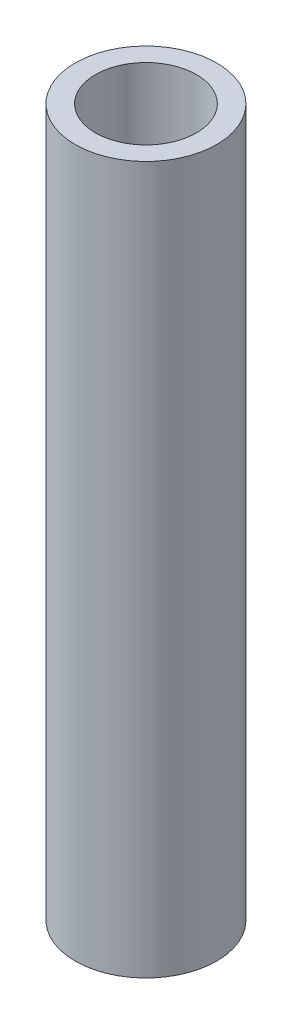
ISO-10303-21;
HEADER;
FILE_DESCRIPTION(('STEP AP214'),'2;1');
FILE_NAME('part.step','',(''),(''),'','','');
FILE_SCHEMA(('AUTOMOTIVE_DESIGN { 1 0 10303 214 1 1 1 1 }'));
ENDSEC;
DATA;
#1=APPLICATION_CONTEXT('core data for automotive mechanical design processes');
#2=APPLICATION_PROTOCOL_DEFINITION('international standard','automotive_design',2000,#1);
#3=PRODUCT_CONTEXT('',#1,'mechanical');
#4=PRODUCT('Part','Part','',(#3));
#5=PRODUCT_RELATED_PRODUCT_CATEGORY('part','',(#4));
#6=PRODUCT_DEFINITION_FORMATION('','',#4);
#7=PRODUCT_DEFINITION_CONTEXT('part definition',#1,'design');
#8=PRODUCT_DEFINITION('design','',#6,#7);
#9=PRODUCT_DEFINITION_SHAPE('','',#8);
#10=(LENGTH_UNIT() NAMED_UNIT(*) SI_UNIT(.MILLI.,.METRE.));
#11=(NAMED_UNIT(*) PLANE_ANGLE_UNIT() SI_UNIT($,.RADIAN.));
#12=(NAMED_UNIT(*) SI_UNIT($,.STERADIAN.) SOLID_ANGLE_UNIT());
#13=UNCERTAINTY_MEASURE_WITH_UNIT(LENGTH_MEASURE(1.E-05),#10,'distance_accuracy_value','');
#14=(GEOMETRIC_REPRESENTATION_CONTEXT(3) GLOBAL_UNCERTAINTY_ASSIGNED_CONTEXT((#13)) GLOBAL_UNIT_ASSIGNED_CONTEXT((#10,
#11,#12)) REPRESENTATION_CONTEXT('',''));
#15=CARTESIAN_POINT('',(0.,0.,0.));
#16=DIRECTION('',(0.,0.,1.));
#17=DIRECTION('',(1.,0.,0.));
#18=AXIS2_PLACEMENT_3D('',#15,#16,#17);
#19=CARTESIAN_POINT('',(0.,35.,0.));
#20=DIRECTION('',(0.,1.,0.));
#21=DIRECTION('',(0.,0.,1.));
#22=AXIS2_PLACEMENT_3D('',#19,#20,#21);
#23=PLANE('',#22);
#24=CARTESIAN_POINT('',(0.,35.,0.));
#25=DIRECTION('',(0.,1.,0.));
#26=DIRECTION('',(0.,0.,1.));
#27=AXIS2_PLACEMENT_3D('',#24,#25,#26);
#28=CIRCLE('',#27,3.5);
#29=CARTESIAN_POINT('',(0.,35.,3.5));
#30=VERTEX_POINT('',#29);
#31=EDGE_CURVE('E10',#30,#30,#28,.T.);
#32=ORIENTED_EDGE('',*,*,#31,.T.);
#33=EDGE_LOOP('',(#32));
#34=FACE_BOUND('',#33,.T.);
#35=CARTESIAN_POINT('',(0.,35.,0.));
#36=DIRECTION('',(0.,1.,0.));
#37=DIRECTION('',(0.,0.,1.));
#38=AXIS2_PLACEMENT_3D('',#35,#36,#37);
#39=CIRCLE('',#38,2.5);
#40=CARTESIAN_POINT('',(0.,35.,2.5));
#41=VERTEX_POINT('',#40);
#42=EDGE_CURVE('E56',#41,#41,#39,.T.);
#43=ORIENTED_EDGE('',*,*,#42,.F.);
#44=EDGE_LOOP('',(#43));
#45=FACE_BOUND('',#44,.T.);
#46=ADVANCED_FACE('F43',(#34,#45),#23,.T.);
#47=CARTESIAN_POINT('',(0.,0.,0.));
#48=DIRECTION('',(0.,1.,0.));
#49=DIRECTION('',(0.,0.,1.));
#50=AXIS2_PLACEMENT_3D('',#47,#48,#49);
#51=PLANE('',#50);
#52=CARTESIAN_POINT('',(0.,0.,0.));
#53=DIRECTION('',(0.,1.,0.));
#54=DIRECTION('',(0.,0.,1.));
#55=AXIS2_PLACEMENT_3D('',#52,#53,#54);
#56=CIRCLE('',#55,3.5);
#57=CARTESIAN_POINT('',(0.,0.,3.5));
#58=VERTEX_POINT('',#57);
#59=EDGE_CURVE('E47',#58,#58,#56,.T.);
#60=ORIENTED_EDGE('',*,*,#59,.F.);
#61=EDGE_LOOP('',(#60));
#62=FACE_BOUND('',#61,.T.);
#63=CARTESIAN_POINT('',(0.,0.,0.));
#64=DIRECTION('',(0.,1.,0.));
#65=DIRECTION('',(0.,0.,1.));
#66=AXIS2_PLACEMENT_3D('',#63,#64,#65);
#67=CIRCLE('',#66,2.5);
#68=CARTESIAN_POINT('',(0.,0.,2.5));
#69=VERTEX_POINT('',#68);
#70=EDGE_CURVE('E58',#69,#69,#67,.T.);
#71=ORIENTED_EDGE('',*,*,#70,.T.);
#72=EDGE_LOOP('',(#71));
#73=FACE_BOUND('',#72,.T.);
#74=ADVANCED_FACE('F70',(#62,#73),#51,.F.);
#75=CARTESIAN_POINT('',(0.,35.,0.));
#76=DIRECTION('',(0.,-1.,0.));
#77=DIRECTION('',(0.,0.,-1.));
#78=AXIS2_PLACEMENT_3D('',#75,#76,#77);
#79=CYLINDRICAL_SURFACE('',#78,3.5);
#80=ORIENTED_EDGE('',*,*,#31,.F.);
#81=EDGE_LOOP('',(#80));
#82=FACE_BOUND('',#81,.T.);
#83=ORIENTED_EDGE('',*,*,#59,.T.);
#84=EDGE_LOOP('',(#83));
#85=FACE_BOUND('',#84,.T.);
#86=ADVANCED_FACE('F45',(#82,#85),#79,.T.);
#87=CARTESIAN_POINT('',(0.,35.,0.));
#88=DIRECTION('',(0.,-1.,0.));
#89=DIRECTION('',(0.,0.,-1.));
#90=AXIS2_PLACEMENT_3D('',#87,#88,#89);
#91=CYLINDRICAL_SURFACE('',#90,2.5);
#92=ORIENTED_EDGE('',*,*,#42,.T.);
#93=EDGE_LOOP('',(#92));
#94=FACE_BOUND('',#93,.T.);
#95=ORIENTED_EDGE('',*,*,#70,.F.);
#96=EDGE_LOOP('',(#95));
#97=FACE_BOUND('',#96,.T.);
#98=ADVANCED_FACE('F66',(#94,#97),#91,.F.);
#99=CLOSED_SHELL('',(#46,#74,#86,#98));
#100=MANIFOLD_SOLID_BREP('B2',#99);
#101=ADVANCED_BREP_SHAPE_REPRESENTATION('',(#18,#100),#14);
#102=SHAPE_DEFINITION_REPRESENTATION(#9,#101);
ENDSEC;
END-ISO-10303-21;
